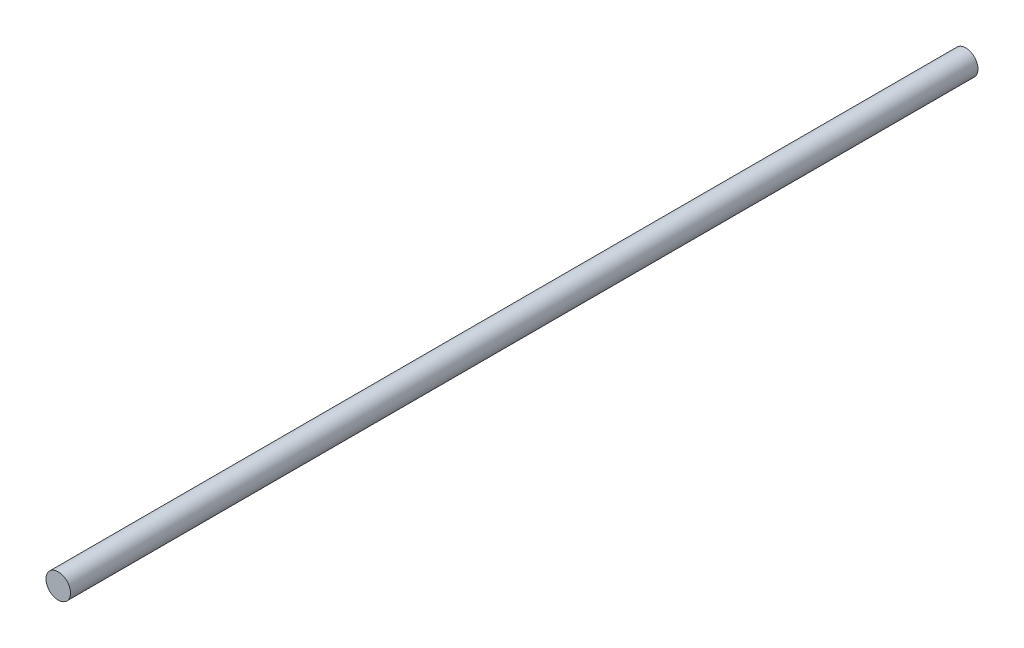
ISO-10303-21;
HEADER;
FILE_DESCRIPTION(('STEP AP214'),'2;1');
FILE_NAME('part.step','',(''),(''),'','','');
FILE_SCHEMA(('AUTOMOTIVE_DESIGN { 1 0 10303 214 1 1 1 1 }'));
ENDSEC;
DATA;
#1=APPLICATION_CONTEXT('core data for automotive mechanical design processes');
#2=APPLICATION_PROTOCOL_DEFINITION('international standard','automotive_design',2000,#1);
#3=PRODUCT_CONTEXT('',#1,'mechanical');
#4=PRODUCT('Part','Part','',(#3));
#5=PRODUCT_RELATED_PRODUCT_CATEGORY('part','',(#4));
#6=PRODUCT_DEFINITION_FORMATION('','',#4);
#7=PRODUCT_DEFINITION_CONTEXT('part definition',#1,'design');
#8=PRODUCT_DEFINITION('design','',#6,#7);
#9=PRODUCT_DEFINITION_SHAPE('','',#8);
#10=(LENGTH_UNIT() NAMED_UNIT(*) SI_UNIT(.MILLI.,.METRE.));
#11=(NAMED_UNIT(*) PLANE_ANGLE_UNIT() SI_UNIT($,.RADIAN.));
#12=(NAMED_UNIT(*) SI_UNIT($,.STERADIAN.) SOLID_ANGLE_UNIT());
#13=UNCERTAINTY_MEASURE_WITH_UNIT(LENGTH_MEASURE(1.E-05),#10,'distance_accuracy_value','');
#14=(GEOMETRIC_REPRESENTATION_CONTEXT(3) GLOBAL_UNCERTAINTY_ASSIGNED_CONTEXT((#13)) GLOBAL_UNIT_ASSIGNED_CONTEXT((#10,
#11,#12)) REPRESENTATION_CONTEXT('',''));
#15=CARTESIAN_POINT('',(0.,0.,0.));
#16=DIRECTION('',(0.,0.,1.));
#17=DIRECTION('',(1.,0.,0.));
#18=AXIS2_PLACEMENT_3D('',#15,#16,#17);
#19=CARTESIAN_POINT('',(0.,0.,117.475));
#20=DIRECTION('',(0.,0.,-1.));
#21=DIRECTION('',(-1.,0.,0.));
#22=AXIS2_PLACEMENT_3D('',#19,#20,#21);
#23=CYLINDRICAL_SURFACE('',#22,1.5875);
#24=CARTESIAN_POINT('',(0.,0.,117.475));
#25=DIRECTION('',(0.,0.,1.));
#26=DIRECTION('',(1.,0.,0.));
#27=AXIS2_PLACEMENT_3D('',#24,#25,#26);
#28=CIRCLE('',#27,1.5875);
#29=CARTESIAN_POINT('',(1.5875,0.,117.475));
#30=VERTEX_POINT('',#29);
#31=EDGE_CURVE('E10',#30,#30,#28,.T.);
#32=ORIENTED_EDGE('',*,*,#31,.F.);
#33=EDGE_LOOP('',(#32));
#34=FACE_BOUND('',#33,.T.);
#35=CARTESIAN_POINT('',(0.,0.,0.));
#36=DIRECTION('',(0.,0.,1.));
#37=DIRECTION('',(1.,0.,0.));
#38=AXIS2_PLACEMENT_3D('',#35,#36,#37);
#39=CIRCLE('',#38,1.5875);
#40=CARTESIAN_POINT('',(1.5875,0.,0.));
#41=VERTEX_POINT('',#40);
#42=EDGE_CURVE('E36',#41,#41,#39,.T.);
#43=ORIENTED_EDGE('',*,*,#42,.T.);
#44=EDGE_LOOP('',(#43));
#45=FACE_BOUND('',#44,.T.);
#46=ADVANCED_FACE('F33',(#34,#45),#23,.T.);
#47=CARTESIAN_POINT('',(0.,0.,117.475));
#48=DIRECTION('',(0.,0.,1.));
#49=DIRECTION('',(1.,0.,0.));
#50=AXIS2_PLACEMENT_3D('',#47,#48,#49);
#51=PLANE('',#50);
#52=ORIENTED_EDGE('',*,*,#31,.T.);
#53=EDGE_LOOP('',(#52));
#54=FACE_BOUND('',#53,.T.);
#55=ADVANCED_FACE('F48',(#54),#51,.T.);
#56=CARTESIAN_POINT('',(0.,0.,0.));
#57=DIRECTION('',(0.,0.,1.));
#58=DIRECTION('',(1.,0.,0.));
#59=AXIS2_PLACEMENT_3D('',#56,#57,#58);
#60=PLANE('',#59);
#61=ORIENTED_EDGE('',*,*,#42,.F.);
#62=EDGE_LOOP('',(#61));
#63=FACE_BOUND('',#62,.T.);
#64=ADVANCED_FACE('F46',(#63),#60,.F.);
#65=CLOSED_SHELL('',(#46,#55,#64));
#66=MANIFOLD_SOLID_BREP('B2',#65);
#67=ADVANCED_BREP_SHAPE_REPRESENTATION('',(#18,#66),#14);
#68=SHAPE_DEFINITION_REPRESENTATION(#9,#67);
ENDSEC;
END-ISO-10303-21;
